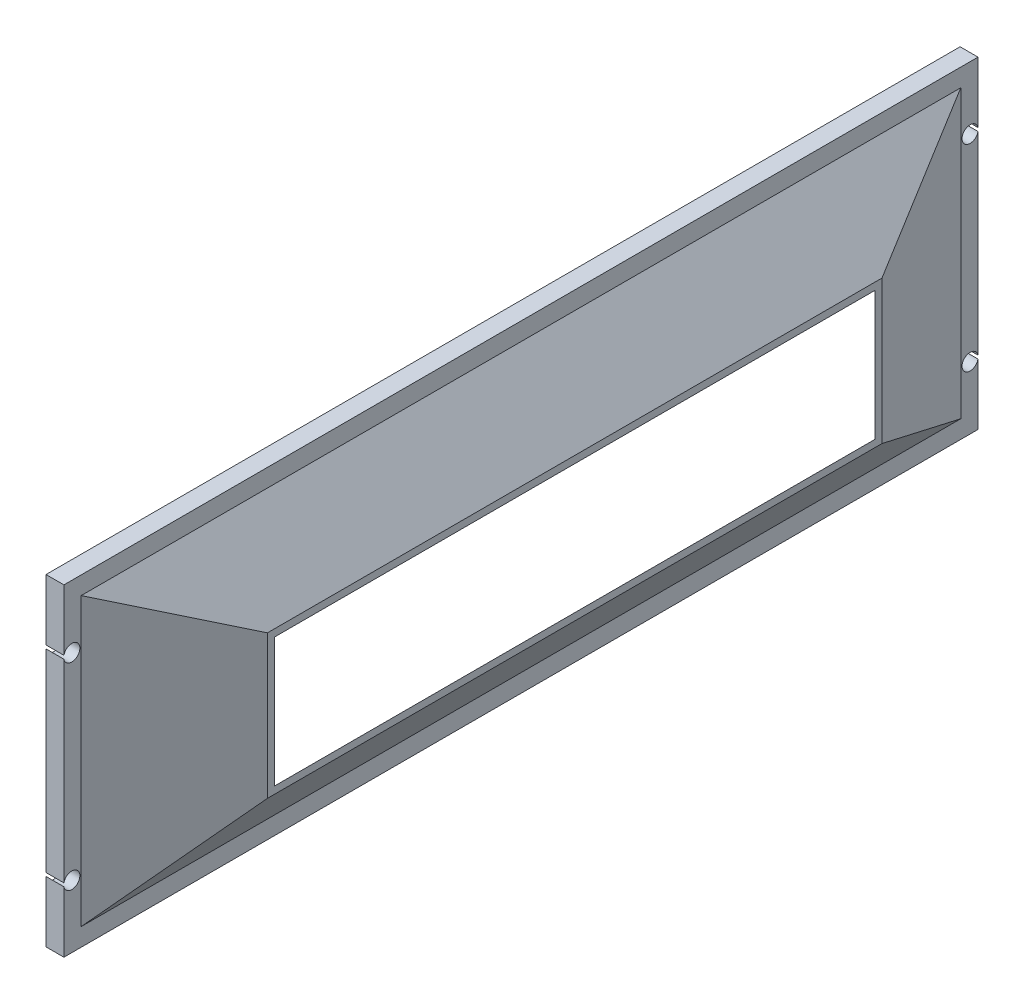
ISO-10303-21;
HEADER;
FILE_DESCRIPTION(('STEP AP214'),'2;1');
FILE_NAME('part.step','',(''),(''),'','','');
FILE_SCHEMA(('AUTOMOTIVE_DESIGN { 1 0 10303 214 1 1 1 1 }'));
ENDSEC;
DATA;
#1=APPLICATION_CONTEXT('core data for automotive mechanical design processes');
#2=APPLICATION_PROTOCOL_DEFINITION('international standard','automotive_design',2000,#1);
#3=PRODUCT_CONTEXT('',#1,'mechanical');
#4=PRODUCT('Part','Part','',(#3));
#5=PRODUCT_RELATED_PRODUCT_CATEGORY('part','',(#4));
#6=PRODUCT_DEFINITION_FORMATION('','',#4);
#7=PRODUCT_DEFINITION_CONTEXT('part definition',#1,'design');
#8=PRODUCT_DEFINITION('design','',#6,#7);
#9=PRODUCT_DEFINITION_SHAPE('','',#8);
#10=(LENGTH_UNIT() NAMED_UNIT(*) SI_UNIT(.MILLI.,.METRE.));
#11=(NAMED_UNIT(*) PLANE_ANGLE_UNIT() SI_UNIT($,.RADIAN.));
#12=(NAMED_UNIT(*) SI_UNIT($,.STERADIAN.) SOLID_ANGLE_UNIT());
#13=UNCERTAINTY_MEASURE_WITH_UNIT(LENGTH_MEASURE(1.E-05),#10,'distance_accuracy_value','');
#14=(GEOMETRIC_REPRESENTATION_CONTEXT(3) GLOBAL_UNCERTAINTY_ASSIGNED_CONTEXT((#13)) GLOBAL_UNIT_ASSIGNED_CONTEXT((#10,
#11,#12)) REPRESENTATION_CONTEXT('',''));
#15=CARTESIAN_POINT('',(0.,0.,0.));
#16=DIRECTION('',(0.,0.,1.));
#17=DIRECTION('',(1.,0.,0.));
#18=AXIS2_PLACEMENT_3D('',#15,#16,#17);
#19=CARTESIAN_POINT('',(5.,-45.,-127.55));
#20=DIRECTION('',(0.,0.,1.));
#21=DIRECTION('',(1.,0.,0.));
#22=AXIS2_PLACEMENT_3D('',#19,#20,#21);
#23=PLANE('',#22);
#24=DIRECTION('',(0.,1.,0.));
#25=VECTOR('',#24,1.);
#26=CARTESIAN_POINT('',(0.,-45.,-127.55));
#27=LINE('',#26,#25);
#28=CARTESIAN_POINT('',(0.,-27.0283009433968,-127.55));
#29=VERTEX_POINT('',#28);
#30=CARTESIAN_POINT('',(0.,27.0283009433968,-127.55));
#31=VERTEX_POINT('',#30);
#32=EDGE_CURVE('E198',#29,#31,#27,.T.);
#33=ORIENTED_EDGE('',*,*,#32,.T.);
#34=DIRECTION('',(1.,0.,0.));
#35=VECTOR('',#34,1.);
#36=CARTESIAN_POINT('',(5.,27.0283009433968,-127.55));
#37=LINE('',#36,#35);
#38=CARTESIAN_POINT('',(5.,27.0283009433968,-127.55));
#39=VERTEX_POINT('',#38);
#40=EDGE_CURVE('E11',#31,#39,#37,.T.);
#41=ORIENTED_EDGE('',*,*,#40,.T.);
#42=DIRECTION('',(0.,1.,0.));
#43=VECTOR('',#42,1.);
#44=CARTESIAN_POINT('',(5.,-45.,-127.55));
#45=LINE('',#44,#43);
#46=CARTESIAN_POINT('',(5.,-27.0283009433968,-127.55));
#47=VERTEX_POINT('',#46);
#48=EDGE_CURVE('E273',#47,#39,#45,.T.);
#49=ORIENTED_EDGE('',*,*,#48,.F.);
#50=DIRECTION('',(1.,0.,0.));
#51=VECTOR('',#50,1.);
#52=CARTESIAN_POINT('',(5.,-27.0283009433968,-127.55));
#53=LINE('',#52,#51);
#54=EDGE_CURVE('E204',#47,#29,#53,.F.);
#55=ORIENTED_EDGE('',*,*,#54,.T.);
#56=EDGE_LOOP('',(#33,#41,#49,#55));
#57=FACE_BOUND('',#56,.T.);
#58=ADVANCED_FACE('F39',(#57),#23,.F.);
#59=CARTESIAN_POINT('',(0.,-45.,-127.55));
#60=VERTEX_POINT('',#59);
#61=CARTESIAN_POINT('',(0.,-27.9716990566032,-127.55));
#62=VERTEX_POINT('',#61);
#63=EDGE_CURVE('E206',#60,#62,#27,.T.);
#64=ORIENTED_EDGE('',*,*,#63,.T.);
#65=DIRECTION('',(1.,0.,0.));
#66=VECTOR('',#65,1.);
#67=CARTESIAN_POINT('',(5.,-27.9716990566032,-127.55));
#68=LINE('',#67,#66);
#69=CARTESIAN_POINT('',(5.,-27.9716990566032,-127.55));
#70=VERTEX_POINT('',#69);
#71=EDGE_CURVE('E262',#62,#70,#68,.T.);
#72=ORIENTED_EDGE('',*,*,#71,.T.);
#73=CARTESIAN_POINT('',(5.,-45.,-127.55));
#74=VERTEX_POINT('',#73);
#75=EDGE_CURVE('E413',#74,#70,#45,.T.);
#76=ORIENTED_EDGE('',*,*,#75,.F.);
#77=DIRECTION('',(-1.,0.,0.));
#78=VECTOR('',#77,1.);
#79=CARTESIAN_POINT('',(5.,-45.,-127.55));
#80=LINE('',#79,#78);
#81=EDGE_CURVE('E229',#74,#60,#80,.T.);
#82=ORIENTED_EDGE('',*,*,#81,.T.);
#83=EDGE_LOOP('',(#64,#72,#76,#82));
#84=FACE_BOUND('',#83,.T.);
#85=ADVANCED_FACE('F443',(#84),#23,.F.);
#86=CARTESIAN_POINT('',(5.,-45.,127.55));
#87=DIRECTION('',(0.,0.,-1.));
#88=DIRECTION('',(-1.,0.,0.));
#89=AXIS2_PLACEMENT_3D('',#86,#87,#88);
#90=PLANE('',#89);
#91=DIRECTION('',(0.,-1.,0.));
#92=VECTOR('',#91,1.);
#93=CARTESIAN_POINT('',(0.,-45.,127.55));
#94=LINE('',#93,#92);
#95=CARTESIAN_POINT('',(0.,45.,127.55));
#96=VERTEX_POINT('',#95);
#97=CARTESIAN_POINT('',(0.,27.9716990566028,127.55));
#98=VERTEX_POINT('',#97);
#99=EDGE_CURVE('E220',#96,#98,#94,.T.);
#100=ORIENTED_EDGE('',*,*,#99,.T.);
#101=DIRECTION('',(1.,0.,0.));
#102=VECTOR('',#101,1.);
#103=CARTESIAN_POINT('',(5.,27.9716990566028,127.55));
#104=LINE('',#103,#102);
#105=CARTESIAN_POINT('',(5.,27.9716990566028,127.55));
#106=VERTEX_POINT('',#105);
#107=EDGE_CURVE('E288',#98,#106,#104,.T.);
#108=ORIENTED_EDGE('',*,*,#107,.T.);
#109=DIRECTION('',(0.,-1.,0.));
#110=VECTOR('',#109,1.);
#111=CARTESIAN_POINT('',(5.,-45.,127.55));
#112=LINE('',#111,#110);
#113=CARTESIAN_POINT('',(5.,45.,127.55));
#114=VERTEX_POINT('',#113);
#115=EDGE_CURVE('E420',#114,#106,#112,.T.);
#116=ORIENTED_EDGE('',*,*,#115,.F.);
#117=DIRECTION('',(-1.,0.,0.));
#118=VECTOR('',#117,1.);
#119=CARTESIAN_POINT('',(5.,45.,127.55));
#120=LINE('',#119,#118);
#121=EDGE_CURVE('E237',#114,#96,#120,.T.);
#122=ORIENTED_EDGE('',*,*,#121,.T.);
#123=EDGE_LOOP('',(#100,#108,#116,#122));
#124=FACE_BOUND('',#123,.T.);
#125=ADVANCED_FACE('F475',(#124),#90,.F.);
#126=CARTESIAN_POINT('',(5.,27.0283009433972,127.55));
#127=VERTEX_POINT('',#126);
#128=CARTESIAN_POINT('',(5.,-27.0283009433972,127.55));
#129=VERTEX_POINT('',#128);
#130=EDGE_CURVE('E423',#127,#129,#112,.T.);
#131=ORIENTED_EDGE('',*,*,#130,.F.);
#132=DIRECTION('',(1.,0.,0.));
#133=VECTOR('',#132,1.);
#134=CARTESIAN_POINT('',(5.,27.0283009433972,127.55));
#135=LINE('',#134,#133);
#136=CARTESIAN_POINT('',(0.,27.0283009433972,127.55));
#137=VERTEX_POINT('',#136);
#138=EDGE_CURVE('E284',#127,#137,#135,.F.);
#139=ORIENTED_EDGE('',*,*,#138,.T.);
#140=CARTESIAN_POINT('',(0.,-27.0283009433972,127.55));
#141=VERTEX_POINT('',#140);
#142=EDGE_CURVE('E225',#137,#141,#94,.T.);
#143=ORIENTED_EDGE('',*,*,#142,.T.);
#144=DIRECTION('',(1.,0.,0.));
#145=VECTOR('',#144,1.);
#146=CARTESIAN_POINT('',(5.,-27.0283009433972,127.55));
#147=LINE('',#146,#145);
#148=EDGE_CURVE('E253',#141,#129,#147,.T.);
#149=ORIENTED_EDGE('',*,*,#148,.T.);
#150=EDGE_LOOP('',(#131,#139,#143,#149));
#151=FACE_BOUND('',#150,.T.);
#152=ADVANCED_FACE('F452',(#151),#90,.F.);
#153=CARTESIAN_POINT('',(20.,40.,-85.75));
#154=DIRECTION('',(-0.926739268223405,0.,0.375705108739218));
#155=DIRECTION('',(0.375705108739218,0.,0.926739268223405));
#156=AXIS2_PLACEMENT_3D('',#153,#154,#155);
#157=PLANE('',#156);
#158=DIRECTION('',(0.,-1.,0.));
#159=VECTOR('',#158,1.);
#160=CARTESIAN_POINT('',(20.,40.,-85.75));
#161=LINE('',#160,#159);
#162=CARTESIAN_POINT('',(20.,20.,-85.75));
#163=VERTEX_POINT('',#162);
#164=CARTESIAN_POINT('',(20.,-20.,-85.75));
#165=VERTEX_POINT('',#164);
#166=EDGE_CURVE('E360',#163,#165,#161,.T.);
#167=ORIENTED_EDGE('',*,*,#166,.T.);
#168=DIRECTION('',(-0.335914446766792,-0.447885929022389,-0.82858896869142));
#169=VECTOR('',#168,1.);
#170=CARTESIAN_POINT('',(29.0270812437312,-7.96389167502508,-63.4831995987963));
#171=LINE('',#170,#169);
#172=CARTESIAN_POINT('',(5.,-40.,-122.75));
#173=VERTEX_POINT('',#172);
#174=EDGE_CURVE('E304',#165,#173,#171,.T.);
#175=ORIENTED_EDGE('',*,*,#174,.T.);
#176=DIRECTION('',(0.,-1.,0.));
#177=VECTOR('',#176,1.);
#178=CARTESIAN_POINT('',(5.,40.,-122.75));
#179=LINE('',#178,#177);
#180=CARTESIAN_POINT('',(5.,40.,-122.75));
#181=VERTEX_POINT('',#180);
#182=EDGE_CURVE('E356',#181,#173,#179,.T.);
#183=ORIENTED_EDGE('',*,*,#182,.F.);
#184=DIRECTION('',(-0.335914446766792,0.447885929022389,-0.82858896869142));
#185=VECTOR('',#184,1.);
#186=CARTESIAN_POINT('',(16.9909729187563,24.012036108325,-93.1722668004012));
#187=LINE('',#186,#185);
#188=EDGE_CURVE('E312',#163,#181,#187,.T.);
#189=ORIENTED_EDGE('',*,*,#188,.F.);
#190=EDGE_LOOP('',(#167,#175,#183,#189));
#191=FACE_BOUND('',#190,.T.);
#192=ADVANCED_FACE('F503',(#191),#157,.F.);
#193=CARTESIAN_POINT('',(20.,40.,85.75));
#194=DIRECTION('',(0.926739268223405,0.,0.375705108739218));
#195=DIRECTION('',(0.375705108739218,0.,-0.926739268223405));
#196=AXIS2_PLACEMENT_3D('',#193,#194,#195);
#197=PLANE('',#196);
#198=DIRECTION('',(-0.335914446766792,-0.447885929022389,0.82858896869142));
#199=VECTOR('',#198,1.);
#200=CARTESIAN_POINT('',(29.0270812437312,-7.96389167502508,63.4831995987963));
#201=LINE('',#200,#199);
#202=CARTESIAN_POINT('',(20.,-20.,85.75));
#203=VERTEX_POINT('',#202);
#204=CARTESIAN_POINT('',(5.,-40.,122.75));
#205=VERTEX_POINT('',#204);
#206=EDGE_CURVE('E300',#203,#205,#201,.T.);
#207=ORIENTED_EDGE('',*,*,#206,.F.);
#208=DIRECTION('',(0.,-1.,0.));
#209=VECTOR('',#208,1.);
#210=CARTESIAN_POINT('',(20.,40.,85.75));
#211=LINE('',#210,#209);
#212=CARTESIAN_POINT('',(20.,20.,85.75));
#213=VERTEX_POINT('',#212);
#214=EDGE_CURVE('E342',#213,#203,#211,.T.);
#215=ORIENTED_EDGE('',*,*,#214,.F.);
#216=DIRECTION('',(-0.335914446766792,0.447885929022389,0.82858896869142));
#217=VECTOR('',#216,1.);
#218=CARTESIAN_POINT('',(16.9909729187563,24.012036108325,93.1722668004012));
#219=LINE('',#218,#217);
#220=CARTESIAN_POINT('',(5.,40.,122.75));
#221=VERTEX_POINT('',#220);
#222=EDGE_CURVE('E308',#213,#221,#219,.T.);
#223=ORIENTED_EDGE('',*,*,#222,.T.);
#224=DIRECTION('',(0.,-1.,0.));
#225=VECTOR('',#224,1.);
#226=CARTESIAN_POINT('',(5.,40.,122.75));
#227=LINE('',#226,#225);
#228=EDGE_CURVE('E346',#221,#205,#227,.T.);
#229=ORIENTED_EDGE('',*,*,#228,.T.);
#230=EDGE_LOOP('',(#207,#215,#223,#229));
#231=FACE_BOUND('',#230,.T.);
#232=ADVANCED_FACE('F507',(#231),#197,.T.);
#233=CARTESIAN_POINT('',(20.,40.,-83.75));
#234=DIRECTION('',(-1.,0.,0.));
#235=DIRECTION('',(0.,0.,1.));
#236=AXIS2_PLACEMENT_3D('',#233,#234,#235);
#237=PLANE('',#236);
#238=DIRECTION('',(0.,-1.,0.));
#239=VECTOR('',#238,1.);
#240=CARTESIAN_POINT('',(20.,40.,-83.75));
#241=LINE('',#240,#239);
#242=CARTESIAN_POINT('',(20.,18.,-83.75));
#243=VERTEX_POINT('',#242);
#244=CARTESIAN_POINT('',(20.,-18.,-83.75));
#245=VERTEX_POINT('',#244);
#246=EDGE_CURVE('E364',#243,#245,#241,.T.);
#247=ORIENTED_EDGE('',*,*,#246,.T.);
#248=DIRECTION('',(0.,0.,-1.));
#249=VECTOR('',#248,1.);
#250=CARTESIAN_POINT('',(20.,-18.,120.75));
#251=LINE('',#250,#249);
#252=CARTESIAN_POINT('',(20.,-18.,83.75));
#253=VERTEX_POINT('',#252);
#254=EDGE_CURVE('E315',#253,#245,#251,.T.);
#255=ORIENTED_EDGE('',*,*,#254,.F.);
#256=DIRECTION('',(0.,-1.,0.));
#257=VECTOR('',#256,1.);
#258=CARTESIAN_POINT('',(20.,40.,83.75));
#259=LINE('',#258,#257);
#260=CARTESIAN_POINT('',(20.,18.,83.75));
#261=VERTEX_POINT('',#260);
#262=EDGE_CURVE('E338',#261,#253,#259,.T.);
#263=ORIENTED_EDGE('',*,*,#262,.F.);
#264=DIRECTION('',(0.,0.,-1.));
#265=VECTOR('',#264,1.);
#266=CARTESIAN_POINT('',(20.,18.,120.75));
#267=LINE('',#266,#265);
#268=EDGE_CURVE('E331',#261,#243,#267,.T.);
#269=ORIENTED_EDGE('',*,*,#268,.T.);
#270=EDGE_LOOP('',(#247,#255,#263,#269));
#271=FACE_BOUND('',#270,.T.);
#272=ORIENTED_EDGE('',*,*,#214,.T.);
#273=DIRECTION('',(0.,0.,-1.));
#274=VECTOR('',#273,1.);
#275=CARTESIAN_POINT('',(20.,-20.,120.75));
#276=LINE('',#275,#274);
#277=EDGE_CURVE('E318',#203,#165,#276,.T.);
#278=ORIENTED_EDGE('',*,*,#277,.T.);
#279=ORIENTED_EDGE('',*,*,#166,.F.);
#280=DIRECTION('',(0.,0.,-1.));
#281=VECTOR('',#280,1.);
#282=CARTESIAN_POINT('',(20.,20.,120.75));
#283=LINE('',#282,#281);
#284=EDGE_CURVE('E328',#213,#163,#283,.T.);
#285=ORIENTED_EDGE('',*,*,#284,.F.);
#286=EDGE_LOOP('',(#272,#278,#279,#285));
#287=FACE_BOUND('',#286,.T.);
#288=ADVANCED_FACE('F513',(#271,#287),#237,.F.);
#289=CARTESIAN_POINT('',(5.,0.,0.));
#290=DIRECTION('',(-1.,0.,0.));
#291=DIRECTION('',(0.,0.,1.));
#292=AXIS2_PLACEMENT_3D('',#289,#290,#291);
#293=PLANE('',#292);
#294=ORIENTED_EDGE('',*,*,#182,.T.);
#295=DIRECTION('',(0.,0.,-1.));
#296=VECTOR('',#295,1.);
#297=CARTESIAN_POINT('',(5.,-40.,-120.75));
#298=LINE('',#297,#296);
#299=EDGE_CURVE('E350',#205,#173,#298,.T.);
#300=ORIENTED_EDGE('',*,*,#299,.F.);
#301=ORIENTED_EDGE('',*,*,#228,.F.);
#302=DIRECTION('',(0.,0.,1.));
#303=VECTOR('',#302,1.);
#304=CARTESIAN_POINT('',(5.,40.,-120.75));
#305=LINE('',#304,#303);
#306=EDGE_CURVE('E353',#181,#221,#305,.T.);
#307=ORIENTED_EDGE('',*,*,#306,.F.);
#308=EDGE_LOOP('',(#294,#300,#301,#307));
#309=FACE_BOUND('',#308,.T.);
#310=ORIENTED_EDGE('',*,*,#48,.T.);
#311=CARTESIAN_POINT('',(5.,27.5,-125.35));
#312=DIRECTION('',(1.,0.,0.));
#313=DIRECTION('',(0.,0.,-1.));
#314=AXIS2_PLACEMENT_3D('',#311,#312,#313);
#315=CIRCLE('',#314,2.25);
#316=CARTESIAN_POINT('',(5.,27.9716990566032,-127.55));
#317=VERTEX_POINT('',#316);
#318=EDGE_CURVE('E188',#317,#39,#315,.T.);
#319=ORIENTED_EDGE('',*,*,#318,.F.);
#320=CARTESIAN_POINT('',(5.,45.,-127.55));
#321=VERTEX_POINT('',#320);
#322=EDGE_CURVE('E228',#317,#321,#45,.T.);
#323=ORIENTED_EDGE('',*,*,#322,.T.);
#324=DIRECTION('',(0.,0.,1.));
#325=VECTOR('',#324,1.);
#326=CARTESIAN_POINT('',(5.,45.,127.55));
#327=LINE('',#326,#325);
#328=EDGE_CURVE('E417',#321,#114,#327,.T.);
#329=ORIENTED_EDGE('',*,*,#328,.T.);
#330=ORIENTED_EDGE('',*,*,#115,.T.);
#331=CARTESIAN_POINT('',(5.,27.5,125.35));
#332=DIRECTION('',(1.,0.,0.));
#333=DIRECTION('',(0.,0.,-1.));
#334=AXIS2_PLACEMENT_3D('',#331,#332,#333);
#335=CIRCLE('',#334,2.25);
#336=EDGE_CURVE('E281',#127,#106,#335,.T.);
#337=ORIENTED_EDGE('',*,*,#336,.F.);
#338=ORIENTED_EDGE('',*,*,#130,.T.);
#339=CARTESIAN_POINT('',(5.,-27.5,125.35));
#340=DIRECTION('',(1.,0.,0.));
#341=DIRECTION('',(0.,0.,-1.));
#342=AXIS2_PLACEMENT_3D('',#339,#340,#341);
#343=CIRCLE('',#342,2.25);
#344=CARTESIAN_POINT('',(5.,-27.9716990566028,127.55));
#345=VERTEX_POINT('',#344);
#346=EDGE_CURVE('E292',#345,#129,#343,.T.);
#347=ORIENTED_EDGE('',*,*,#346,.F.);
#348=CARTESIAN_POINT('',(5.,-45.,127.55));
#349=VERTEX_POINT('',#348);
#350=EDGE_CURVE('E419',#345,#349,#112,.T.);
#351=ORIENTED_EDGE('',*,*,#350,.T.);
#352=DIRECTION('',(0.,0.,-1.));
#353=VECTOR('',#352,1.);
#354=CARTESIAN_POINT('',(5.,-45.,127.55));
#355=LINE('',#354,#353);
#356=EDGE_CURVE('E215',#349,#74,#355,.T.);
#357=ORIENTED_EDGE('',*,*,#356,.T.);
#358=ORIENTED_EDGE('',*,*,#75,.T.);
#359=CARTESIAN_POINT('',(5.,-27.5,-125.35));
#360=DIRECTION('',(1.,0.,0.));
#361=DIRECTION('',(0.,0.,-1.));
#362=AXIS2_PLACEMENT_3D('',#359,#360,#361);
#363=CIRCLE('',#362,2.25);
#364=EDGE_CURVE('E202',#47,#70,#363,.T.);
#365=ORIENTED_EDGE('',*,*,#364,.F.);
#366=EDGE_LOOP('',(#310,#319,#323,#329,#330,#337,#338,#347,#351,#357,#358,#365));
#367=FACE_BOUND('',#366,.T.);
#368=ADVANCED_FACE('F270',(#309,#367),#293,.F.);
#369=CARTESIAN_POINT('',(5.,40.,-120.75));
#370=DIRECTION('',(0.926739268223405,0.,-0.375705108739218));
#371=DIRECTION('',(-0.375705108739218,0.,-0.926739268223405));
#372=AXIS2_PLACEMENT_3D('',#369,#370,#371);
#373=PLANE('',#372);
#374=DIRECTION('',(-0.335914446766792,-0.447885929022389,-0.82858896869142));
#375=VECTOR('',#374,1.);
#376=CARTESIAN_POINT('',(16.7352056168506,-22.3530591775326,-91.8031594784353));
#377=LINE('',#376,#375);
#378=CARTESIAN_POINT('',(5.,-38.,-120.75));
#379=VERTEX_POINT('',#378);
#380=EDGE_CURVE('E325',#245,#379,#377,.T.);
#381=ORIENTED_EDGE('',*,*,#380,.F.);
#382=ORIENTED_EDGE('',*,*,#246,.F.);
#383=DIRECTION('',(0.335914446766792,-0.447885929022389,0.82858896869142));
#384=VECTOR('',#383,1.);
#385=CARTESIAN_POINT('',(4.69909729187563,38.4012036108325,-121.49222668004));
#386=LINE('',#385,#384);
#387=CARTESIAN_POINT('',(5.,38.,-120.75));
#388=VERTEX_POINT('',#387);
#389=EDGE_CURVE('E335',#388,#243,#386,.T.);
#390=ORIENTED_EDGE('',*,*,#389,.F.);
#391=DIRECTION('',(0.,1.,0.));
#392=VECTOR('',#391,1.);
#393=CARTESIAN_POINT('',(5.,-38.,-120.75));
#394=LINE('',#393,#392);
#395=EDGE_CURVE('E369',#379,#388,#394,.T.);
#396=ORIENTED_EDGE('',*,*,#395,.F.);
#397=EDGE_LOOP('',(#381,#382,#390,#396));
#398=FACE_BOUND('',#397,.T.);
#399=ADVANCED_FACE('F488',(#398),#373,.F.);
#400=CARTESIAN_POINT('',(5.,40.,120.75));
#401=DIRECTION('',(-0.926739268223405,0.,-0.375705108739218));
#402=DIRECTION('',(-0.375705108739218,0.,0.926739268223405));
#403=AXIS2_PLACEMENT_3D('',#400,#401,#402);
#404=PLANE('',#403);
#405=ORIENTED_EDGE('',*,*,#262,.T.);
#406=DIRECTION('',(-0.335914446766792,-0.447885929022389,0.82858896869142));
#407=VECTOR('',#406,1.);
#408=CARTESIAN_POINT('',(16.7352056168506,-22.3530591775326,91.8031594784353));
#409=LINE('',#408,#407);
#410=CARTESIAN_POINT('',(5.,-38.,120.75));
#411=VERTEX_POINT('',#410);
#412=EDGE_CURVE('E321',#253,#411,#409,.T.);
#413=ORIENTED_EDGE('',*,*,#412,.T.);
#414=DIRECTION('',(0.,-1.,0.));
#415=VECTOR('',#414,1.);
#416=CARTESIAN_POINT('',(5.,-38.,120.75));
#417=LINE('',#416,#415);
#418=CARTESIAN_POINT('',(5.,38.,120.75));
#419=VERTEX_POINT('',#418);
#420=EDGE_CURVE('E378',#419,#411,#417,.T.);
#421=ORIENTED_EDGE('',*,*,#420,.F.);
#422=DIRECTION('',(0.335914446766792,-0.447885929022389,-0.82858896869142));
#423=VECTOR('',#422,1.);
#424=CARTESIAN_POINT('',(4.69909729187563,38.4012036108325,121.49222668004));
#425=LINE('',#424,#423);
#426=EDGE_CURVE('E245',#419,#261,#425,.T.);
#427=ORIENTED_EDGE('',*,*,#426,.T.);
#428=EDGE_LOOP('',(#405,#413,#421,#427));
#429=FACE_BOUND('',#428,.T.);
#430=ADVANCED_FACE('F483',(#429),#404,.T.);
#431=CARTESIAN_POINT('',(0.,0.,0.));
#432=DIRECTION('',(-1.,0.,0.));
#433=DIRECTION('',(0.,0.,1.));
#434=AXIS2_PLACEMENT_3D('',#431,#432,#433);
#435=PLANE('',#434);
#436=CARTESIAN_POINT('',(0.,27.5,-125.35));
#437=DIRECTION('',(1.,0.,0.));
#438=DIRECTION('',(0.,0.,-1.));
#439=AXIS2_PLACEMENT_3D('',#436,#437,#438);
#440=CIRCLE('',#439,2.25);
#441=CARTESIAN_POINT('',(0.,27.9716990566031,-127.55));
#442=VERTEX_POINT('',#441);
#443=EDGE_CURVE('E55',#442,#31,#440,.T.);
#444=ORIENTED_EDGE('',*,*,#443,.T.);
#445=ORIENTED_EDGE('',*,*,#32,.F.);
#446=CARTESIAN_POINT('',(0.,-27.5,-125.35));
#447=DIRECTION('',(1.,0.,0.));
#448=DIRECTION('',(0.,0.,-1.));
#449=AXIS2_PLACEMENT_3D('',#446,#447,#448);
#450=CIRCLE('',#449,2.25);
#451=EDGE_CURVE('E63',#29,#62,#450,.T.);
#452=ORIENTED_EDGE('',*,*,#451,.T.);
#453=ORIENTED_EDGE('',*,*,#63,.F.);
#454=DIRECTION('',(0.,0.,-1.));
#455=VECTOR('',#454,1.);
#456=CARTESIAN_POINT('',(0.,-45.,127.55));
#457=LINE('',#456,#455);
#458=CARTESIAN_POINT('',(0.,-45.,127.55));
#459=VERTEX_POINT('',#458);
#460=EDGE_CURVE('E224',#459,#60,#457,.T.);
#461=ORIENTED_EDGE('',*,*,#460,.F.);
#462=CARTESIAN_POINT('',(0.,-27.9716990566028,127.55));
#463=VERTEX_POINT('',#462);
#464=EDGE_CURVE('E219',#463,#459,#94,.T.);
#465=ORIENTED_EDGE('',*,*,#464,.F.);
#466=CARTESIAN_POINT('',(0.,-27.5,125.35));
#467=DIRECTION('',(1.,0.,0.));
#468=DIRECTION('',(0.,0.,-1.));
#469=AXIS2_PLACEMENT_3D('',#466,#467,#468);
#470=CIRCLE('',#469,2.25);
#471=EDGE_CURVE('E296',#463,#141,#470,.T.);
#472=ORIENTED_EDGE('',*,*,#471,.T.);
#473=ORIENTED_EDGE('',*,*,#142,.F.);
#474=CARTESIAN_POINT('',(0.,27.5,125.35));
#475=DIRECTION('',(-1.,0.,0.));
#476=DIRECTION('',(0.,0.,1.));
#477=AXIS2_PLACEMENT_3D('',#474,#475,#476);
#478=CIRCLE('',#477,2.25);
#479=EDGE_CURVE('E257',#98,#137,#478,.T.);
#480=ORIENTED_EDGE('',*,*,#479,.F.);
#481=ORIENTED_EDGE('',*,*,#99,.F.);
#482=DIRECTION('',(0.,0.,1.));
#483=VECTOR('',#482,1.);
#484=CARTESIAN_POINT('',(0.,45.,127.55));
#485=LINE('',#484,#483);
#486=CARTESIAN_POINT('',(0.,45.,-127.55));
#487=VERTEX_POINT('',#486);
#488=EDGE_CURVE('E211',#487,#96,#485,.T.);
#489=ORIENTED_EDGE('',*,*,#488,.F.);
#490=EDGE_CURVE('E200',#442,#487,#27,.T.);
#491=ORIENTED_EDGE('',*,*,#490,.F.);
#492=EDGE_LOOP('',(#444,#445,#452,#453,#461,#465,#472,#473,#480,#481,#489,#491));
#493=FACE_BOUND('',#492,.T.);
#494=DIRECTION('',(0.,0.,-1.));
#495=VECTOR('',#494,1.);
#496=CARTESIAN_POINT('',(0.,-38.,120.75));
#497=LINE('',#496,#495);
#498=CARTESIAN_POINT('',(0.,-38.,120.75));
#499=VERTEX_POINT('',#498);
#500=CARTESIAN_POINT('',(0.,-38.,-120.75));
#501=VERTEX_POINT('',#500);
#502=EDGE_CURVE('E374',#499,#501,#497,.T.);
#503=ORIENTED_EDGE('',*,*,#502,.T.);
#504=DIRECTION('',(0.,1.,0.));
#505=VECTOR('',#504,1.);
#506=CARTESIAN_POINT('',(0.,-38.,-120.75));
#507=LINE('',#506,#505);
#508=CARTESIAN_POINT('',(0.,38.,-120.75));
#509=VERTEX_POINT('',#508);
#510=EDGE_CURVE('E368',#501,#509,#507,.T.);
#511=ORIENTED_EDGE('',*,*,#510,.T.);
#512=DIRECTION('',(0.,0.,1.));
#513=VECTOR('',#512,1.);
#514=CARTESIAN_POINT('',(0.,38.,120.75));
#515=LINE('',#514,#513);
#516=CARTESIAN_POINT('',(0.,38.,120.75));
#517=VERTEX_POINT('',#516);
#518=EDGE_CURVE('E390',#509,#517,#515,.T.);
#519=ORIENTED_EDGE('',*,*,#518,.T.);
#520=DIRECTION('',(0.,-1.,0.));
#521=VECTOR('',#520,1.);
#522=CARTESIAN_POINT('',(0.,-38.,120.75));
#523=LINE('',#522,#521);
#524=EDGE_CURVE('E394',#517,#499,#523,.T.);
#525=ORIENTED_EDGE('',*,*,#524,.T.);
#526=EDGE_LOOP('',(#503,#511,#519,#525));
#527=FACE_BOUND('',#526,.T.);
#528=ADVANCED_FACE('F196',(#493,#527),#435,.T.);
#529=ORIENTED_EDGE('',*,*,#322,.F.);
#530=DIRECTION('',(1.,0.,0.));
#531=VECTOR('',#530,1.);
#532=CARTESIAN_POINT('',(5.,27.9716990566032,-127.55));
#533=LINE('',#532,#531);
#534=EDGE_CURVE('E48',#317,#442,#533,.F.);
#535=ORIENTED_EDGE('',*,*,#534,.T.);
#536=ORIENTED_EDGE('',*,*,#490,.T.);
#537=DIRECTION('',(-1.,0.,0.));
#538=VECTOR('',#537,1.);
#539=CARTESIAN_POINT('',(5.,45.,-127.55));
#540=LINE('',#539,#538);
#541=EDGE_CURVE('E241',#321,#487,#540,.T.);
#542=ORIENTED_EDGE('',*,*,#541,.F.);
#543=EDGE_LOOP('',(#529,#535,#536,#542));
#544=FACE_BOUND('',#543,.T.);
#545=ADVANCED_FACE('F41',(#544),#23,.F.);
#546=CARTESIAN_POINT('',(5.,45.,127.55));
#547=DIRECTION('',(0.,-1.,0.));
#548=DIRECTION('',(0.,0.,-1.));
#549=AXIS2_PLACEMENT_3D('',#546,#547,#548);
#550=PLANE('',#549);
#551=ORIENTED_EDGE('',*,*,#488,.T.);
#552=ORIENTED_EDGE('',*,*,#121,.F.);
#553=ORIENTED_EDGE('',*,*,#328,.F.);
#554=ORIENTED_EDGE('',*,*,#541,.T.);
#555=EDGE_LOOP('',(#551,#552,#553,#554));
#556=FACE_BOUND('',#555,.T.);
#557=ADVANCED_FACE('F477',(#556),#550,.F.);
#558=ORIENTED_EDGE('',*,*,#350,.F.);
#559=DIRECTION('',(1.,0.,0.));
#560=VECTOR('',#559,1.);
#561=CARTESIAN_POINT('',(5.,-27.9716990566028,127.55));
#562=LINE('',#561,#560);
#563=EDGE_CURVE('E249',#345,#463,#562,.F.);
#564=ORIENTED_EDGE('',*,*,#563,.T.);
#565=ORIENTED_EDGE('',*,*,#464,.T.);
#566=DIRECTION('',(-1.,0.,0.));
#567=VECTOR('',#566,1.);
#568=CARTESIAN_POINT('',(5.,-45.,127.55));
#569=LINE('',#568,#567);
#570=EDGE_CURVE('E233',#349,#459,#569,.T.);
#571=ORIENTED_EDGE('',*,*,#570,.F.);
#572=EDGE_LOOP('',(#558,#564,#565,#571));
#573=FACE_BOUND('',#572,.T.);
#574=ADVANCED_FACE('F435',(#573),#90,.F.);
#575=CARTESIAN_POINT('',(5.,-45.,127.55));
#576=DIRECTION('',(0.,1.,0.));
#577=DIRECTION('',(0.,0.,1.));
#578=AXIS2_PLACEMENT_3D('',#575,#576,#577);
#579=PLANE('',#578);
#580=ORIENTED_EDGE('',*,*,#460,.T.);
#581=ORIENTED_EDGE('',*,*,#81,.F.);
#582=ORIENTED_EDGE('',*,*,#356,.F.);
#583=ORIENTED_EDGE('',*,*,#570,.T.);
#584=EDGE_LOOP('',(#580,#581,#582,#583));
#585=FACE_BOUND('',#584,.T.);
#586=ADVANCED_FACE('F439',(#585),#579,.F.);
#587=CARTESIAN_POINT('',(5.,-38.,-120.75));
#588=DIRECTION('',(0.,0.,1.));
#589=DIRECTION('',(1.,0.,0.));
#590=AXIS2_PLACEMENT_3D('',#587,#588,#589);
#591=PLANE('',#590);
#592=ORIENTED_EDGE('',*,*,#510,.F.);
#593=DIRECTION('',(-1.,0.,0.));
#594=VECTOR('',#593,1.);
#595=CARTESIAN_POINT('',(5.,-38.,-120.75));
#596=LINE('',#595,#594);
#597=EDGE_CURVE('E386',#379,#501,#596,.T.);
#598=ORIENTED_EDGE('',*,*,#597,.F.);
#599=ORIENTED_EDGE('',*,*,#395,.T.);
#600=DIRECTION('',(-1.,0.,0.));
#601=VECTOR('',#600,1.);
#602=CARTESIAN_POINT('',(5.,38.,-120.75));
#603=LINE('',#602,#601);
#604=EDGE_CURVE('E212',#388,#509,#603,.T.);
#605=ORIENTED_EDGE('',*,*,#604,.T.);
#606=EDGE_LOOP('',(#592,#598,#599,#605));
#607=FACE_BOUND('',#606,.T.);
#608=ADVANCED_FACE('F496',(#607),#591,.T.);
#609=CARTESIAN_POINT('',(5.,38.,120.75));
#610=DIRECTION('',(0.,-1.,0.));
#611=DIRECTION('',(0.,0.,-1.));
#612=AXIS2_PLACEMENT_3D('',#609,#610,#611);
#613=PLANE('',#612);
#614=ORIENTED_EDGE('',*,*,#518,.F.);
#615=ORIENTED_EDGE('',*,*,#604,.F.);
#616=DIRECTION('',(0.,0.,1.));
#617=VECTOR('',#616,1.);
#618=CARTESIAN_POINT('',(5.,38.,120.75));
#619=LINE('',#618,#617);
#620=EDGE_CURVE('E373',#388,#419,#619,.T.);
#621=ORIENTED_EDGE('',*,*,#620,.T.);
#622=DIRECTION('',(-1.,0.,0.));
#623=VECTOR('',#622,1.);
#624=CARTESIAN_POINT('',(5.,38.,120.75));
#625=LINE('',#624,#623);
#626=EDGE_CURVE('E407',#419,#517,#625,.T.);
#627=ORIENTED_EDGE('',*,*,#626,.T.);
#628=EDGE_LOOP('',(#614,#615,#621,#627));
#629=FACE_BOUND('',#628,.T.);
#630=ADVANCED_FACE('F531',(#629),#613,.T.);
#631=CARTESIAN_POINT('',(5.,-38.,120.75));
#632=DIRECTION('',(0.,0.,-1.));
#633=DIRECTION('',(-1.,0.,0.));
#634=AXIS2_PLACEMENT_3D('',#631,#632,#633);
#635=PLANE('',#634);
#636=ORIENTED_EDGE('',*,*,#524,.F.);
#637=ORIENTED_EDGE('',*,*,#626,.F.);
#638=ORIENTED_EDGE('',*,*,#420,.T.);
#639=DIRECTION('',(-1.,0.,0.));
#640=VECTOR('',#639,1.);
#641=CARTESIAN_POINT('',(5.,-38.,120.75));
#642=LINE('',#641,#640);
#643=EDGE_CURVE('E404',#411,#499,#642,.T.);
#644=ORIENTED_EDGE('',*,*,#643,.T.);
#645=EDGE_LOOP('',(#636,#637,#638,#644));
#646=FACE_BOUND('',#645,.T.);
#647=ADVANCED_FACE('F527',(#646),#635,.T.);
#648=CARTESIAN_POINT('',(5.,-38.,120.75));
#649=DIRECTION('',(0.,1.,0.));
#650=DIRECTION('',(0.,0.,1.));
#651=AXIS2_PLACEMENT_3D('',#648,#649,#650);
#652=PLANE('',#651);
#653=ORIENTED_EDGE('',*,*,#502,.F.);
#654=ORIENTED_EDGE('',*,*,#643,.F.);
#655=DIRECTION('',(0.,0.,-1.));
#656=VECTOR('',#655,1.);
#657=CARTESIAN_POINT('',(5.,-38.,120.75));
#658=LINE('',#657,#656);
#659=EDGE_CURVE('E382',#411,#379,#658,.T.);
#660=ORIENTED_EDGE('',*,*,#659,.T.);
#661=ORIENTED_EDGE('',*,*,#597,.T.);
#662=EDGE_LOOP('',(#653,#654,#660,#661));
#663=FACE_BOUND('',#662,.T.);
#664=ADVANCED_FACE('F523',(#663),#652,.T.);
#665=CARTESIAN_POINT('',(20.,20.,120.75));
#666=DIRECTION('',(-0.8,-0.6,0.));
#667=DIRECTION('',(0.6,-0.8,0.));
#668=AXIS2_PLACEMENT_3D('',#665,#666,#667);
#669=PLANE('',#668);
#670=ORIENTED_EDGE('',*,*,#284,.T.);
#671=ORIENTED_EDGE('',*,*,#188,.T.);
#672=ORIENTED_EDGE('',*,*,#306,.T.);
#673=ORIENTED_EDGE('',*,*,#222,.F.);
#674=EDGE_LOOP('',(#670,#671,#672,#673));
#675=FACE_BOUND('',#674,.T.);
#676=ADVANCED_FACE('F526',(#675),#669,.F.);
#677=CARTESIAN_POINT('',(5.,38.,120.75));
#678=DIRECTION('',(0.8,0.6,0.));
#679=DIRECTION('',(-0.6,0.8,0.));
#680=AXIS2_PLACEMENT_3D('',#677,#678,#679);
#681=PLANE('',#680);
#682=ORIENTED_EDGE('',*,*,#620,.F.);
#683=ORIENTED_EDGE('',*,*,#389,.T.);
#684=ORIENTED_EDGE('',*,*,#268,.F.);
#685=ORIENTED_EDGE('',*,*,#426,.F.);
#686=EDGE_LOOP('',(#682,#683,#684,#685));
#687=FACE_BOUND('',#686,.T.);
#688=ADVANCED_FACE('F549',(#687),#681,.F.);
#689=CARTESIAN_POINT('',(5.,-38.,120.75));
#690=DIRECTION('',(0.8,-0.6,0.));
#691=DIRECTION('',(0.6,0.8,0.));
#692=AXIS2_PLACEMENT_3D('',#689,#690,#691);
#693=PLANE('',#692);
#694=ORIENTED_EDGE('',*,*,#254,.T.);
#695=ORIENTED_EDGE('',*,*,#380,.T.);
#696=ORIENTED_EDGE('',*,*,#659,.F.);
#697=ORIENTED_EDGE('',*,*,#412,.F.);
#698=EDGE_LOOP('',(#694,#695,#696,#697));
#699=FACE_BOUND('',#698,.T.);
#700=ADVANCED_FACE('F467',(#699),#693,.F.);
#701=CARTESIAN_POINT('',(20.,-20.,120.75));
#702=DIRECTION('',(-0.8,0.6,0.));
#703=DIRECTION('',(-0.6,-0.8,0.));
#704=AXIS2_PLACEMENT_3D('',#701,#702,#703);
#705=PLANE('',#704);
#706=ORIENTED_EDGE('',*,*,#206,.T.);
#707=ORIENTED_EDGE('',*,*,#299,.T.);
#708=ORIENTED_EDGE('',*,*,#174,.F.);
#709=ORIENTED_EDGE('',*,*,#277,.F.);
#710=EDGE_LOOP('',(#706,#707,#708,#709));
#711=FACE_BOUND('',#710,.T.);
#712=ADVANCED_FACE('F458',(#711),#705,.F.);
#713=CARTESIAN_POINT('',(5.,-27.5,125.35));
#714=DIRECTION('',(1.,0.,0.));
#715=DIRECTION('',(0.,0.,-1.));
#716=AXIS2_PLACEMENT_3D('',#713,#714,#715);
#717=CYLINDRICAL_SURFACE('',#716,2.25);
#718=ORIENTED_EDGE('',*,*,#471,.F.);
#719=ORIENTED_EDGE('',*,*,#563,.F.);
#720=ORIENTED_EDGE('',*,*,#346,.T.);
#721=ORIENTED_EDGE('',*,*,#148,.F.);
#722=EDGE_LOOP('',(#718,#719,#720,#721));
#723=FACE_BOUND('',#722,.T.);
#724=ADVANCED_FACE('F455',(#723),#717,.F.);
#725=CARTESIAN_POINT('',(5.,27.5,125.35));
#726=DIRECTION('',(1.,0.,0.));
#727=DIRECTION('',(0.,0.,-1.));
#728=AXIS2_PLACEMENT_3D('',#725,#726,#727);
#729=CYLINDRICAL_SURFACE('',#728,2.25);
#730=ORIENTED_EDGE('',*,*,#479,.T.);
#731=ORIENTED_EDGE('',*,*,#138,.F.);
#732=ORIENTED_EDGE('',*,*,#336,.T.);
#733=ORIENTED_EDGE('',*,*,#107,.F.);
#734=EDGE_LOOP('',(#730,#731,#732,#733));
#735=FACE_BOUND('',#734,.T.);
#736=ADVANCED_FACE('F457',(#735),#729,.F.);
#737=CARTESIAN_POINT('',(5.,-27.5,-125.35));
#738=DIRECTION('',(1.,0.,0.));
#739=DIRECTION('',(0.,0.,-1.));
#740=AXIS2_PLACEMENT_3D('',#737,#738,#739);
#741=CYLINDRICAL_SURFACE('',#740,2.25);
#742=ORIENTED_EDGE('',*,*,#451,.F.);
#743=ORIENTED_EDGE('',*,*,#54,.F.);
#744=ORIENTED_EDGE('',*,*,#364,.T.);
#745=ORIENTED_EDGE('',*,*,#71,.F.);
#746=EDGE_LOOP('',(#742,#743,#744,#745));
#747=FACE_BOUND('',#746,.T.);
#748=ADVANCED_FACE('F464',(#747),#741,.F.);
#749=CARTESIAN_POINT('',(5.,27.5,-125.35));
#750=DIRECTION('',(1.,0.,0.));
#751=DIRECTION('',(0.,0.,-1.));
#752=AXIS2_PLACEMENT_3D('',#749,#750,#751);
#753=CYLINDRICAL_SURFACE('',#752,2.25);
#754=ORIENTED_EDGE('',*,*,#443,.F.);
#755=ORIENTED_EDGE('',*,*,#534,.F.);
#756=ORIENTED_EDGE('',*,*,#318,.T.);
#757=ORIENTED_EDGE('',*,*,#40,.F.);
#758=EDGE_LOOP('',(#754,#755,#756,#757));
#759=FACE_BOUND('',#758,.T.);
#760=ADVANCED_FACE('F186',(#759),#753,.F.);
#761=CLOSED_SHELL('',(#58,#85,#125,#152,#192,#232,#288,#368,#399,#430,#528,#545,#557,#574,#586,
#608,#630,#647,#664,#676,#688,#700,#712,#724,#736,#748,#760));
#762=MANIFOLD_SOLID_BREP('B2',#761);
#763=ADVANCED_BREP_SHAPE_REPRESENTATION('',(#18,#762),#14);
#764=SHAPE_DEFINITION_REPRESENTATION(#9,#763);
ENDSEC;
END-ISO-10303-21;
